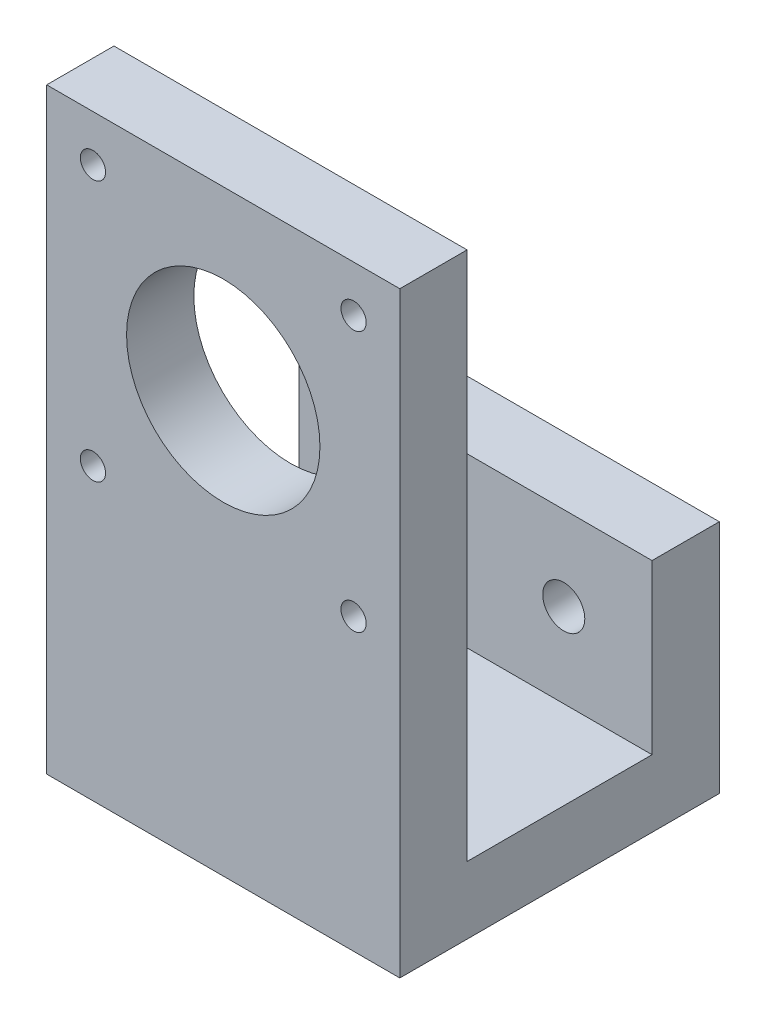
ISO-10303-21;
HEADER;
FILE_DESCRIPTION(('STEP AP214'),'2;1');
FILE_NAME('part.step','',(''),(''),'','','');
FILE_SCHEMA(('AUTOMOTIVE_DESIGN { 1 0 10303 214 1 1 1 1 }'));
ENDSEC;
DATA;
#1=APPLICATION_CONTEXT('core data for automotive mechanical design processes');
#2=APPLICATION_PROTOCOL_DEFINITION('international standard','automotive_design',2000,#1);
#3=PRODUCT_CONTEXT('',#1,'mechanical');
#4=PRODUCT('Part','Part','',(#3));
#5=PRODUCT_RELATED_PRODUCT_CATEGORY('part','',(#4));
#6=PRODUCT_DEFINITION_FORMATION('','',#4);
#7=PRODUCT_DEFINITION_CONTEXT('part definition',#1,'design');
#8=PRODUCT_DEFINITION('design','',#6,#7);
#9=PRODUCT_DEFINITION_SHAPE('','',#8);
#10=(LENGTH_UNIT() NAMED_UNIT(*) SI_UNIT(.MILLI.,.METRE.));
#11=(NAMED_UNIT(*) PLANE_ANGLE_UNIT() SI_UNIT($,.RADIAN.));
#12=(NAMED_UNIT(*) SI_UNIT($,.STERADIAN.) SOLID_ANGLE_UNIT());
#13=UNCERTAINTY_MEASURE_WITH_UNIT(LENGTH_MEASURE(1.E-05),#10,'distance_accuracy_value','');
#14=(GEOMETRIC_REPRESENTATION_CONTEXT(3) GLOBAL_UNCERTAINTY_ASSIGNED_CONTEXT((#13)) GLOBAL_UNIT_ASSIGNED_CONTEXT((#10,
#11,#12)) REPRESENTATION_CONTEXT('',''));
#15=CARTESIAN_POINT('',(0.,0.,0.));
#16=DIRECTION('',(0.,0.,1.));
#17=DIRECTION('',(1.,0.,0.));
#18=AXIS2_PLACEMENT_3D('',#15,#16,#17);
#19=CARTESIAN_POINT('',(29.76,0.,8.));
#20=DIRECTION('',(1.,0.,0.));
#21=DIRECTION('',(0.,1.,0.));
#22=AXIS2_PLACEMENT_3D('',#19,#20,#21);
#23=PLANE('',#22);
#24=DIRECTION('',(0.,-1.,0.));
#25=VECTOR('',#24,1.);
#26=CARTESIAN_POINT('',(29.76,0.,0.));
#27=LINE('',#26,#25);
#28=CARTESIAN_POINT('',(29.76,18.6,0.));
#29=VERTEX_POINT('',#28);
#30=CARTESIAN_POINT('',(29.76,-9.40000000000002,0.));
#31=VERTEX_POINT('',#30);
#32=EDGE_CURVE('E84',#29,#31,#27,.T.);
#33=ORIENTED_EDGE('',*,*,#32,.F.);
#34=DIRECTION('',(0.,0.,-1.));
#35=VECTOR('',#34,1.);
#36=CARTESIAN_POINT('',(29.76,18.6,8.));
#37=LINE('',#36,#35);
#38=CARTESIAN_POINT('',(29.76,18.6,8.));
#39=VERTEX_POINT('',#38);
#40=EDGE_CURVE('E11',#39,#29,#37,.T.);
#41=ORIENTED_EDGE('',*,*,#40,.F.);
#42=DIRECTION('',(0.,-1.,0.));
#43=VECTOR('',#42,1.);
#44=CARTESIAN_POINT('',(29.76,0.,8.));
#45=LINE('',#44,#43);
#46=CARTESIAN_POINT('',(29.76,-1.40000000000002,8.));
#47=VERTEX_POINT('',#46);
#48=EDGE_CURVE('E81',#39,#47,#45,.T.);
#49=ORIENTED_EDGE('',*,*,#48,.T.);
#50=DIRECTION('',(0.,0.,-1.));
#51=VECTOR('',#50,1.);
#52=CARTESIAN_POINT('',(29.76,-1.40000000000002,30.));
#53=LINE('',#52,#51);
#54=CARTESIAN_POINT('',(29.76,-1.40000000000002,30.));
#55=VERTEX_POINT('',#54);
#56=EDGE_CURVE('E54',#55,#47,#53,.T.);
#57=ORIENTED_EDGE('',*,*,#56,.F.);
#58=DIRECTION('',(0.,1.,0.));
#59=VECTOR('',#58,1.);
#60=CARTESIAN_POINT('',(29.76,-9.40000000000002,30.));
#61=LINE('',#60,#59);
#62=CARTESIAN_POINT('',(29.76,61.6,30.));
#63=VERTEX_POINT('',#62);
#64=EDGE_CURVE('E350',#55,#63,#61,.T.);
#65=ORIENTED_EDGE('',*,*,#64,.T.);
#66=DIRECTION('',(0.,0.,-1.));
#67=VECTOR('',#66,1.);
#68=CARTESIAN_POINT('',(29.76,61.6,38.));
#69=LINE('',#68,#67);
#70=CARTESIAN_POINT('',(29.76,61.6,38.));
#71=VERTEX_POINT('',#70);
#72=EDGE_CURVE('E128',#71,#63,#69,.T.);
#73=ORIENTED_EDGE('',*,*,#72,.F.);
#74=DIRECTION('',(0.,1.,0.));
#75=VECTOR('',#74,1.);
#76=CARTESIAN_POINT('',(29.76,-9.40000000000002,38.));
#77=LINE('',#76,#75);
#78=CARTESIAN_POINT('',(29.76,-9.40000000000002,38.));
#79=VERTEX_POINT('',#78);
#80=EDGE_CURVE('E353',#79,#71,#77,.T.);
#81=ORIENTED_EDGE('',*,*,#80,.F.);
#82=DIRECTION('',(0.,0.,-1.));
#83=VECTOR('',#82,1.);
#84=CARTESIAN_POINT('',(29.76,-9.40000000000002,30.));
#85=LINE('',#84,#83);
#86=EDGE_CURVE('E130',#79,#31,#85,.T.);
#87=ORIENTED_EDGE('',*,*,#86,.T.);
#88=EDGE_LOOP('',(#33,#41,#49,#57,#65,#73,#81,#87));
#89=FACE_BOUND('',#88,.T.);
#90=ADVANCED_FACE('F37',(#89),#23,.T.);
#91=CARTESIAN_POINT('',(0.,18.6,8.));
#92=DIRECTION('',(0.,1.,0.));
#93=DIRECTION('',(0.,0.,1.));
#94=AXIS2_PLACEMENT_3D('',#91,#92,#93);
#95=PLANE('',#94);
#96=DIRECTION('',(1.,0.,0.));
#97=VECTOR('',#96,1.);
#98=CARTESIAN_POINT('',(0.,18.6,0.));
#99=LINE('',#98,#97);
#100=CARTESIAN_POINT('',(-12.24,18.6,0.));
#101=VERTEX_POINT('',#100);
#102=EDGE_CURVE('E108',#101,#29,#99,.T.);
#103=ORIENTED_EDGE('',*,*,#102,.F.);
#104=DIRECTION('',(0.,0.,-1.));
#105=VECTOR('',#104,1.);
#106=CARTESIAN_POINT('',(-12.24,18.6,8.));
#107=LINE('',#106,#105);
#108=CARTESIAN_POINT('',(-12.24,18.6,8.));
#109=VERTEX_POINT('',#108);
#110=EDGE_CURVE('E46',#109,#101,#107,.T.);
#111=ORIENTED_EDGE('',*,*,#110,.F.);
#112=DIRECTION('',(1.,0.,0.));
#113=VECTOR('',#112,1.);
#114=CARTESIAN_POINT('',(0.,18.6,8.));
#115=LINE('',#114,#113);
#116=EDGE_CURVE('E90',#109,#39,#115,.T.);
#117=ORIENTED_EDGE('',*,*,#116,.T.);
#118=ORIENTED_EDGE('',*,*,#40,.T.);
#119=EDGE_LOOP('',(#103,#111,#117,#118));
#120=FACE_BOUND('',#119,.T.);
#121=ADVANCED_FACE('F93',(#120),#95,.T.);
#122=CARTESIAN_POINT('',(-12.24,0.,8.));
#123=DIRECTION('',(1.,0.,0.));
#124=DIRECTION('',(0.,1.,0.));
#125=AXIS2_PLACEMENT_3D('',#122,#123,#124);
#126=PLANE('',#125);
#127=DIRECTION('',(0.,-1.,0.));
#128=VECTOR('',#127,1.);
#129=CARTESIAN_POINT('',(-12.24,0.,0.));
#130=LINE('',#129,#128);
#131=CARTESIAN_POINT('',(-12.24,-9.40000000000002,0.));
#132=VERTEX_POINT('',#131);
#133=EDGE_CURVE('E110',#101,#132,#130,.T.);
#134=ORIENTED_EDGE('',*,*,#133,.T.);
#135=DIRECTION('',(0.,0.,-1.));
#136=VECTOR('',#135,1.);
#137=CARTESIAN_POINT('',(-12.24,-9.40000000000002,30.));
#138=LINE('',#137,#136);
#139=CARTESIAN_POINT('',(-12.24,-9.40000000000002,38.));
#140=VERTEX_POINT('',#139);
#141=EDGE_CURVE('E137',#140,#132,#138,.T.);
#142=ORIENTED_EDGE('',*,*,#141,.F.);
#143=DIRECTION('',(0.,-1.,0.));
#144=VECTOR('',#143,1.);
#145=CARTESIAN_POINT('',(-12.24,-9.40000000000002,38.));
#146=LINE('',#145,#144);
#147=CARTESIAN_POINT('',(-12.24,61.6,38.));
#148=VERTEX_POINT('',#147);
#149=EDGE_CURVE('E360',#148,#140,#146,.T.);
#150=ORIENTED_EDGE('',*,*,#149,.F.);
#151=DIRECTION('',(0.,0.,-1.));
#152=VECTOR('',#151,1.);
#153=CARTESIAN_POINT('',(-12.24,61.6,38.));
#154=LINE('',#153,#152);
#155=CARTESIAN_POINT('',(-12.24,61.6,30.));
#156=VERTEX_POINT('',#155);
#157=EDGE_CURVE('E133',#148,#156,#154,.T.);
#158=ORIENTED_EDGE('',*,*,#157,.T.);
#159=DIRECTION('',(0.,-1.,0.));
#160=VECTOR('',#159,1.);
#161=CARTESIAN_POINT('',(-12.24,-9.40000000000002,30.));
#162=LINE('',#161,#160);
#163=CARTESIAN_POINT('',(-12.24,-1.40000000000002,30.));
#164=VERTEX_POINT('',#163);
#165=EDGE_CURVE('E357',#156,#164,#162,.T.);
#166=ORIENTED_EDGE('',*,*,#165,.T.);
#167=DIRECTION('',(0.,0.,-1.));
#168=VECTOR('',#167,1.);
#169=CARTESIAN_POINT('',(-12.24,-1.40000000000002,30.));
#170=LINE('',#169,#168);
#171=CARTESIAN_POINT('',(-12.24,-1.40000000000002,8.));
#172=VERTEX_POINT('',#171);
#173=EDGE_CURVE('E139',#164,#172,#170,.T.);
#174=ORIENTED_EDGE('',*,*,#173,.T.);
#175=DIRECTION('',(0.,-1.,0.));
#176=VECTOR('',#175,1.);
#177=CARTESIAN_POINT('',(-12.24,0.,8.));
#178=LINE('',#177,#176);
#179=EDGE_CURVE('E95',#109,#172,#178,.T.);
#180=ORIENTED_EDGE('',*,*,#179,.F.);
#181=ORIENTED_EDGE('',*,*,#110,.T.);
#182=EDGE_LOOP('',(#134,#142,#150,#158,#166,#174,#180,#181));
#183=FACE_BOUND('',#182,.T.);
#184=ADVANCED_FACE('F115',(#183),#126,.F.);
#185=CARTESIAN_POINT('',(-1.74000000000001,8.59999999999998,8.));
#186=DIRECTION('',(0.,0.,-1.));
#187=DIRECTION('',(-1.,0.,0.));
#188=AXIS2_PLACEMENT_3D('',#185,#186,#187);
#189=CYLINDRICAL_SURFACE('',#188,2.5);
#190=CARTESIAN_POINT('',(-1.74000000000001,8.59999999999998,8.));
#191=DIRECTION('',(0.,0.,1.));
#192=DIRECTION('',(1.,0.,0.));
#193=AXIS2_PLACEMENT_3D('',#190,#191,#192);
#194=CIRCLE('',#193,2.5);
#195=CARTESIAN_POINT('',(0.759999999999988,8.59999999999998,8.));
#196=VERTEX_POINT('',#195);
#197=EDGE_CURVE('E91',#196,#196,#194,.T.);
#198=ORIENTED_EDGE('',*,*,#197,.T.);
#199=EDGE_LOOP('',(#198));
#200=FACE_BOUND('',#199,.T.);
#201=CARTESIAN_POINT('',(-1.74000000000001,8.59999999999998,0.));
#202=DIRECTION('',(0.,0.,1.));
#203=DIRECTION('',(1.,0.,0.));
#204=AXIS2_PLACEMENT_3D('',#201,#202,#203);
#205=CIRCLE('',#204,2.5);
#206=CARTESIAN_POINT('',(0.759999999999988,8.59999999999998,0.));
#207=VERTEX_POINT('',#206);
#208=EDGE_CURVE('E104',#207,#207,#205,.T.);
#209=ORIENTED_EDGE('',*,*,#208,.F.);
#210=EDGE_LOOP('',(#209));
#211=FACE_BOUND('',#210,.T.);
#212=ADVANCED_FACE('F146',(#200,#211),#189,.F.);
#213=CARTESIAN_POINT('',(19.26,8.59999999999998,8.));
#214=DIRECTION('',(0.,0.,-1.));
#215=DIRECTION('',(-1.,0.,0.));
#216=AXIS2_PLACEMENT_3D('',#213,#214,#215);
#217=CYLINDRICAL_SURFACE('',#216,2.5);
#218=CARTESIAN_POINT('',(19.26,8.59999999999998,8.));
#219=DIRECTION('',(0.,0.,1.));
#220=DIRECTION('',(1.,0.,0.));
#221=AXIS2_PLACEMENT_3D('',#218,#219,#220);
#222=CIRCLE('',#221,2.5);
#223=CARTESIAN_POINT('',(21.76,8.59999999999998,8.));
#224=VERTEX_POINT('',#223);
#225=EDGE_CURVE('E112',#224,#224,#222,.T.);
#226=ORIENTED_EDGE('',*,*,#225,.T.);
#227=EDGE_LOOP('',(#226));
#228=FACE_BOUND('',#227,.T.);
#229=CARTESIAN_POINT('',(19.26,8.59999999999998,0.));
#230=DIRECTION('',(0.,0.,1.));
#231=DIRECTION('',(1.,0.,0.));
#232=AXIS2_PLACEMENT_3D('',#229,#230,#231);
#233=CIRCLE('',#232,2.5);
#234=CARTESIAN_POINT('',(21.76,8.59999999999998,0.));
#235=VERTEX_POINT('',#234);
#236=EDGE_CURVE('E101',#235,#235,#233,.T.);
#237=ORIENTED_EDGE('',*,*,#236,.F.);
#238=EDGE_LOOP('',(#237));
#239=FACE_BOUND('',#238,.T.);
#240=ADVANCED_FACE('F39',(#228,#239),#217,.F.);
#241=CARTESIAN_POINT('',(0.,0.,8.));
#242=DIRECTION('',(0.,0.,1.));
#243=DIRECTION('',(1.,0.,0.));
#244=AXIS2_PLACEMENT_3D('',#241,#242,#243);
#245=PLANE('',#244);
#246=ORIENTED_EDGE('',*,*,#225,.F.);
#247=EDGE_LOOP('',(#246));
#248=FACE_BOUND('',#247,.T.);
#249=ORIENTED_EDGE('',*,*,#197,.F.);
#250=EDGE_LOOP('',(#249));
#251=FACE_BOUND('',#250,.T.);
#252=ORIENTED_EDGE('',*,*,#48,.F.);
#253=ORIENTED_EDGE('',*,*,#116,.F.);
#254=ORIENTED_EDGE('',*,*,#179,.T.);
#255=DIRECTION('',(1.,0.,0.));
#256=VECTOR('',#255,1.);
#257=CARTESIAN_POINT('',(0.,-1.40000000000002,8.));
#258=LINE('',#257,#256);
#259=EDGE_CURVE('E71',#172,#47,#258,.T.);
#260=ORIENTED_EDGE('',*,*,#259,.T.);
#261=EDGE_LOOP('',(#252,#253,#254,#260));
#262=FACE_BOUND('',#261,.T.);
#263=ADVANCED_FACE('F88',(#248,#251,#262),#245,.T.);
#264=CARTESIAN_POINT('',(0.,0.,0.));
#265=DIRECTION('',(0.,0.,1.));
#266=DIRECTION('',(1.,0.,0.));
#267=AXIS2_PLACEMENT_3D('',#264,#265,#266);
#268=PLANE('',#267);
#269=ORIENTED_EDGE('',*,*,#236,.T.);
#270=EDGE_LOOP('',(#269));
#271=FACE_BOUND('',#270,.T.);
#272=ORIENTED_EDGE('',*,*,#208,.T.);
#273=EDGE_LOOP('',(#272));
#274=FACE_BOUND('',#273,.T.);
#275=ORIENTED_EDGE('',*,*,#32,.T.);
#276=DIRECTION('',(1.,0.,0.));
#277=VECTOR('',#276,1.);
#278=CARTESIAN_POINT('',(0.,-9.40000000000002,0.));
#279=LINE('',#278,#277);
#280=EDGE_CURVE('E123',#132,#31,#279,.T.);
#281=ORIENTED_EDGE('',*,*,#280,.F.);
#282=ORIENTED_EDGE('',*,*,#133,.F.);
#283=ORIENTED_EDGE('',*,*,#102,.T.);
#284=EDGE_LOOP('',(#275,#281,#282,#283));
#285=FACE_BOUND('',#284,.T.);
#286=ADVANCED_FACE('F121',(#271,#274,#285),#268,.F.);
#287=CARTESIAN_POINT('',(0.,-1.40000000000002,30.));
#288=DIRECTION('',(0.,1.,0.));
#289=DIRECTION('',(0.,0.,1.));
#290=AXIS2_PLACEMENT_3D('',#287,#288,#289);
#291=PLANE('',#290);
#292=ORIENTED_EDGE('',*,*,#259,.F.);
#293=ORIENTED_EDGE('',*,*,#173,.F.);
#294=DIRECTION('',(1.,0.,0.));
#295=VECTOR('',#294,1.);
#296=CARTESIAN_POINT('',(0.,-1.40000000000002,30.));
#297=LINE('',#296,#295);
#298=EDGE_CURVE('E127',#164,#55,#297,.T.);
#299=ORIENTED_EDGE('',*,*,#298,.T.);
#300=ORIENTED_EDGE('',*,*,#56,.T.);
#301=EDGE_LOOP('',(#292,#293,#299,#300));
#302=FACE_BOUND('',#301,.T.);
#303=ADVANCED_FACE('F156',(#302),#291,.T.);
#304=CARTESIAN_POINT('',(0.,-9.40000000000002,30.));
#305=DIRECTION('',(0.,1.,0.));
#306=DIRECTION('',(0.,0.,1.));
#307=AXIS2_PLACEMENT_3D('',#304,#305,#306);
#308=PLANE('',#307);
#309=ORIENTED_EDGE('',*,*,#280,.T.);
#310=ORIENTED_EDGE('',*,*,#86,.F.);
#311=DIRECTION('',(1.,0.,0.));
#312=VECTOR('',#311,1.);
#313=CARTESIAN_POINT('',(29.76,-9.40000000000002,38.));
#314=LINE('',#313,#312);
#315=EDGE_CURVE('E363',#140,#79,#314,.T.);
#316=ORIENTED_EDGE('',*,*,#315,.F.);
#317=ORIENTED_EDGE('',*,*,#141,.T.);
#318=EDGE_LOOP('',(#309,#310,#316,#317));
#319=FACE_BOUND('',#318,.T.);
#320=ADVANCED_FACE('F218',(#319),#308,.F.);
#321=CARTESIAN_POINT('',(0.,0.,38.));
#322=DIRECTION('',(0.,0.,1.));
#323=DIRECTION('',(1.,0.,0.));
#324=AXIS2_PLACEMENT_3D('',#321,#322,#323);
#325=PLANE('',#324);
#326=CARTESIAN_POINT('',(24.26,25.1,38.));
#327=DIRECTION('',(0.,0.,1.));
#328=DIRECTION('',(1.,0.,0.));
#329=AXIS2_PLACEMENT_3D('',#326,#327,#328);
#330=CIRCLE('',#329,1.5);
#331=CARTESIAN_POINT('',(25.76,25.1,38.));
#332=VERTEX_POINT('',#331);
#333=EDGE_CURVE('E329',#332,#332,#330,.T.);
#334=ORIENTED_EDGE('',*,*,#333,.F.);
#335=EDGE_LOOP('',(#334));
#336=FACE_BOUND('',#335,.T.);
#337=CARTESIAN_POINT('',(-6.74,56.1,38.));
#338=DIRECTION('',(0.,0.,1.));
#339=DIRECTION('',(1.,0.,0.));
#340=AXIS2_PLACEMENT_3D('',#337,#338,#339);
#341=CIRCLE('',#340,1.5);
#342=CARTESIAN_POINT('',(-5.24,56.1,38.));
#343=VERTEX_POINT('',#342);
#344=EDGE_CURVE('E341',#343,#343,#341,.T.);
#345=ORIENTED_EDGE('',*,*,#344,.F.);
#346=EDGE_LOOP('',(#345));
#347=FACE_BOUND('',#346,.T.);
#348=ORIENTED_EDGE('',*,*,#80,.T.);
#349=DIRECTION('',(-1.,0.,0.));
#350=VECTOR('',#349,1.);
#351=CARTESIAN_POINT('',(29.76,61.6,38.));
#352=LINE('',#351,#350);
#353=EDGE_CURVE('E356',#71,#148,#352,.T.);
#354=ORIENTED_EDGE('',*,*,#353,.T.);
#355=ORIENTED_EDGE('',*,*,#149,.T.);
#356=ORIENTED_EDGE('',*,*,#315,.T.);
#357=EDGE_LOOP('',(#348,#354,#355,#356));
#358=FACE_BOUND('',#357,.T.);
#359=CARTESIAN_POINT('',(24.26,56.1,38.));
#360=DIRECTION('',(0.,0.,1.));
#361=DIRECTION('',(1.,0.,0.));
#362=AXIS2_PLACEMENT_3D('',#359,#360,#361);
#363=CIRCLE('',#362,1.5);
#364=CARTESIAN_POINT('',(25.76,56.1,38.));
#365=VERTEX_POINT('',#364);
#366=EDGE_CURVE('E347',#365,#365,#363,.T.);
#367=ORIENTED_EDGE('',*,*,#366,.F.);
#368=EDGE_LOOP('',(#367));
#369=FACE_BOUND('',#368,.T.);
#370=CARTESIAN_POINT('',(-6.73999999999999,25.1,38.));
#371=DIRECTION('',(0.,0.,1.));
#372=DIRECTION('',(1.,0.,0.));
#373=AXIS2_PLACEMENT_3D('',#370,#371,#372);
#374=CIRCLE('',#373,1.5);
#375=CARTESIAN_POINT('',(-5.23999999999999,25.1,38.));
#376=VERTEX_POINT('',#375);
#377=EDGE_CURVE('E335',#376,#376,#374,.T.);
#378=ORIENTED_EDGE('',*,*,#377,.F.);
#379=EDGE_LOOP('',(#378));
#380=FACE_BOUND('',#379,.T.);
#381=CARTESIAN_POINT('',(8.75999999999999,40.6,38.));
#382=DIRECTION('',(0.,0.,1.));
#383=DIRECTION('',(1.,0.,0.));
#384=AXIS2_PLACEMENT_3D('',#381,#382,#383);
#385=CIRCLE('',#384,11.5);
#386=CARTESIAN_POINT('',(20.26,40.6,38.));
#387=VERTEX_POINT('',#386);
#388=EDGE_CURVE('E320',#387,#387,#385,.T.);
#389=ORIENTED_EDGE('',*,*,#388,.F.);
#390=EDGE_LOOP('',(#389));
#391=FACE_BOUND('',#390,.T.);
#392=ADVANCED_FACE('F231',(#336,#347,#358,#369,#380,#391),#325,.T.);
#393=CARTESIAN_POINT('',(0.,0.,30.));
#394=DIRECTION('',(0.,0.,1.));
#395=DIRECTION('',(1.,0.,0.));
#396=AXIS2_PLACEMENT_3D('',#393,#394,#395);
#397=PLANE('',#396);
#398=ORIENTED_EDGE('',*,*,#298,.F.);
#399=ORIENTED_EDGE('',*,*,#165,.F.);
#400=DIRECTION('',(-1.,0.,0.));
#401=VECTOR('',#400,1.);
#402=CARTESIAN_POINT('',(29.76,61.6,30.));
#403=LINE('',#402,#401);
#404=EDGE_CURVE('E368',#63,#156,#403,.T.);
#405=ORIENTED_EDGE('',*,*,#404,.F.);
#406=ORIENTED_EDGE('',*,*,#64,.F.);
#407=EDGE_LOOP('',(#398,#399,#405,#406));
#408=FACE_BOUND('',#407,.T.);
#409=CARTESIAN_POINT('',(24.26,56.1,30.));
#410=DIRECTION('',(0.,0.,1.));
#411=DIRECTION('',(1.,0.,0.));
#412=AXIS2_PLACEMENT_3D('',#409,#410,#411);
#413=CIRCLE('',#412,1.5);
#414=CARTESIAN_POINT('',(25.76,56.1,30.));
#415=VERTEX_POINT('',#414);
#416=EDGE_CURVE('E344',#415,#415,#413,.T.);
#417=ORIENTED_EDGE('',*,*,#416,.T.);
#418=EDGE_LOOP('',(#417));
#419=FACE_BOUND('',#418,.T.);
#420=CARTESIAN_POINT('',(-6.74,56.1,30.));
#421=DIRECTION('',(0.,0.,1.));
#422=DIRECTION('',(1.,0.,0.));
#423=AXIS2_PLACEMENT_3D('',#420,#421,#422);
#424=CIRCLE('',#423,1.5);
#425=CARTESIAN_POINT('',(-5.24,56.1,30.));
#426=VERTEX_POINT('',#425);
#427=EDGE_CURVE('E338',#426,#426,#424,.T.);
#428=ORIENTED_EDGE('',*,*,#427,.T.);
#429=EDGE_LOOP('',(#428));
#430=FACE_BOUND('',#429,.T.);
#431=CARTESIAN_POINT('',(-6.73999999999999,25.1,30.));
#432=DIRECTION('',(0.,0.,1.));
#433=DIRECTION('',(1.,0.,0.));
#434=AXIS2_PLACEMENT_3D('',#431,#432,#433);
#435=CIRCLE('',#434,1.5);
#436=CARTESIAN_POINT('',(-5.23999999999999,25.1,30.));
#437=VERTEX_POINT('',#436);
#438=EDGE_CURVE('E332',#437,#437,#435,.T.);
#439=ORIENTED_EDGE('',*,*,#438,.T.);
#440=EDGE_LOOP('',(#439));
#441=FACE_BOUND('',#440,.T.);
#442=CARTESIAN_POINT('',(24.26,25.1,30.));
#443=DIRECTION('',(0.,0.,1.));
#444=DIRECTION('',(1.,0.,0.));
#445=AXIS2_PLACEMENT_3D('',#442,#443,#444);
#446=CIRCLE('',#445,1.5);
#447=CARTESIAN_POINT('',(25.76,25.1,30.));
#448=VERTEX_POINT('',#447);
#449=EDGE_CURVE('E326',#448,#448,#446,.T.);
#450=ORIENTED_EDGE('',*,*,#449,.T.);
#451=EDGE_LOOP('',(#450));
#452=FACE_BOUND('',#451,.T.);
#453=CARTESIAN_POINT('',(8.75999999999999,40.6,30.));
#454=DIRECTION('',(0.,0.,1.));
#455=DIRECTION('',(1.,0.,0.));
#456=AXIS2_PLACEMENT_3D('',#453,#454,#455);
#457=CIRCLE('',#456,11.5);
#458=CARTESIAN_POINT('',(20.26,40.6,30.));
#459=VERTEX_POINT('',#458);
#460=EDGE_CURVE('E323',#459,#459,#457,.T.);
#461=ORIENTED_EDGE('',*,*,#460,.T.);
#462=EDGE_LOOP('',(#461));
#463=FACE_BOUND('',#462,.T.);
#464=ADVANCED_FACE('F239',(#408,#419,#430,#441,#452,#463),#397,.F.);
#465=CARTESIAN_POINT('',(29.76,61.6,38.));
#466=DIRECTION('',(0.,-1.,0.));
#467=DIRECTION('',(1.,0.,0.));
#468=AXIS2_PLACEMENT_3D('',#465,#466,#467);
#469=PLANE('',#468);
#470=ORIENTED_EDGE('',*,*,#404,.T.);
#471=ORIENTED_EDGE('',*,*,#157,.F.);
#472=ORIENTED_EDGE('',*,*,#353,.F.);
#473=ORIENTED_EDGE('',*,*,#72,.T.);
#474=EDGE_LOOP('',(#470,#471,#472,#473));
#475=FACE_BOUND('',#474,.T.);
#476=ADVANCED_FACE('F248',(#475),#469,.F.);
#477=CARTESIAN_POINT('',(24.26,56.1,38.));
#478=DIRECTION('',(0.,0.,-1.));
#479=DIRECTION('',(-1.,0.,0.));
#480=AXIS2_PLACEMENT_3D('',#477,#478,#479);
#481=CYLINDRICAL_SURFACE('',#480,1.5);
#482=ORIENTED_EDGE('',*,*,#366,.T.);
#483=EDGE_LOOP('',(#482));
#484=FACE_BOUND('',#483,.T.);
#485=ORIENTED_EDGE('',*,*,#416,.F.);
#486=EDGE_LOOP('',(#485));
#487=FACE_BOUND('',#486,.T.);
#488=ADVANCED_FACE('F257',(#484,#487),#481,.F.);
#489=CARTESIAN_POINT('',(-6.74,56.1,38.));
#490=DIRECTION('',(0.,0.,-1.));
#491=DIRECTION('',(-1.,0.,0.));
#492=AXIS2_PLACEMENT_3D('',#489,#490,#491);
#493=CYLINDRICAL_SURFACE('',#492,1.5);
#494=ORIENTED_EDGE('',*,*,#344,.T.);
#495=EDGE_LOOP('',(#494));
#496=FACE_BOUND('',#495,.T.);
#497=ORIENTED_EDGE('',*,*,#427,.F.);
#498=EDGE_LOOP('',(#497));
#499=FACE_BOUND('',#498,.T.);
#500=ADVANCED_FACE('F266',(#496,#499),#493,.F.);
#501=CARTESIAN_POINT('',(-6.73999999999999,25.1,38.));
#502=DIRECTION('',(0.,0.,-1.));
#503=DIRECTION('',(-1.,0.,0.));
#504=AXIS2_PLACEMENT_3D('',#501,#502,#503);
#505=CYLINDRICAL_SURFACE('',#504,1.5);
#506=ORIENTED_EDGE('',*,*,#377,.T.);
#507=EDGE_LOOP('',(#506));
#508=FACE_BOUND('',#507,.T.);
#509=ORIENTED_EDGE('',*,*,#438,.F.);
#510=EDGE_LOOP('',(#509));
#511=FACE_BOUND('',#510,.T.);
#512=ADVANCED_FACE('F275',(#508,#511),#505,.F.);
#513=CARTESIAN_POINT('',(24.26,25.1,38.));
#514=DIRECTION('',(0.,0.,-1.));
#515=DIRECTION('',(-1.,0.,0.));
#516=AXIS2_PLACEMENT_3D('',#513,#514,#515);
#517=CYLINDRICAL_SURFACE('',#516,1.5);
#518=ORIENTED_EDGE('',*,*,#333,.T.);
#519=EDGE_LOOP('',(#518));
#520=FACE_BOUND('',#519,.T.);
#521=ORIENTED_EDGE('',*,*,#449,.F.);
#522=EDGE_LOOP('',(#521));
#523=FACE_BOUND('',#522,.T.);
#524=ADVANCED_FACE('F284',(#520,#523),#517,.F.);
#525=CARTESIAN_POINT('',(8.75999999999999,40.6,38.));
#526=DIRECTION('',(0.,0.,-1.));
#527=DIRECTION('',(-1.,0.,0.));
#528=AXIS2_PLACEMENT_3D('',#525,#526,#527);
#529=CYLINDRICAL_SURFACE('',#528,11.5);
#530=ORIENTED_EDGE('',*,*,#388,.T.);
#531=EDGE_LOOP('',(#530));
#532=FACE_BOUND('',#531,.T.);
#533=ORIENTED_EDGE('',*,*,#460,.F.);
#534=EDGE_LOOP('',(#533));
#535=FACE_BOUND('',#534,.T.);
#536=ADVANCED_FACE('F293',(#532,#535),#529,.F.);
#537=CLOSED_SHELL('',(#90,#121,#184,#212,#240,#263,#286,#303,#320,#392,#464,#476,#488,#500,#512,
#524,#536));
#538=MANIFOLD_SOLID_BREP('B2',#537);
#539=ADVANCED_BREP_SHAPE_REPRESENTATION('',(#18,#538),#14);
#540=SHAPE_DEFINITION_REPRESENTATION(#9,#539);
ENDSEC;
END-ISO-10303-21;
